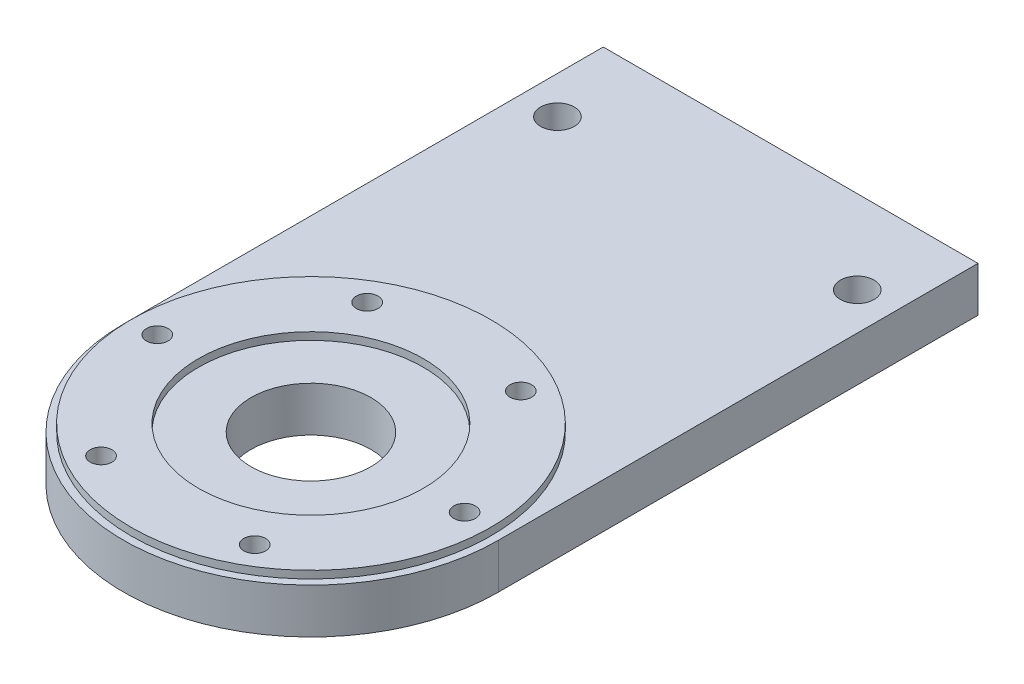
ISO-10303-21;
HEADER;
FILE_DESCRIPTION(('STEP AP214'),'2;1');
FILE_NAME('part.step','',(''),(''),'','','');
FILE_SCHEMA(('AUTOMOTIVE_DESIGN { 1 0 10303 214 1 1 1 1 }'));
ENDSEC;
DATA;
#1=APPLICATION_CONTEXT('core data for automotive mechanical design processes');
#2=APPLICATION_PROTOCOL_DEFINITION('international standard','automotive_design',2000,#1);
#3=PRODUCT_CONTEXT('',#1,'mechanical');
#4=PRODUCT('Part','Part','',(#3));
#5=PRODUCT_RELATED_PRODUCT_CATEGORY('part','',(#4));
#6=PRODUCT_DEFINITION_FORMATION('','',#4);
#7=PRODUCT_DEFINITION_CONTEXT('part definition',#1,'design');
#8=PRODUCT_DEFINITION('design','',#6,#7);
#9=PRODUCT_DEFINITION_SHAPE('','',#8);
#10=(LENGTH_UNIT() NAMED_UNIT(*) SI_UNIT(.MILLI.,.METRE.));
#11=(NAMED_UNIT(*) PLANE_ANGLE_UNIT() SI_UNIT($,.RADIAN.));
#12=(NAMED_UNIT(*) SI_UNIT($,.STERADIAN.) SOLID_ANGLE_UNIT());
#13=UNCERTAINTY_MEASURE_WITH_UNIT(LENGTH_MEASURE(1.E-05),#10,'distance_accuracy_value','');
#14=(GEOMETRIC_REPRESENTATION_CONTEXT(3) GLOBAL_UNCERTAINTY_ASSIGNED_CONTEXT((#13)) GLOBAL_UNIT_ASSIGNED_CONTEXT((#10,
#11,#12)) REPRESENTATION_CONTEXT('',''));
#15=CARTESIAN_POINT('',(0.,0.,0.));
#16=DIRECTION('',(0.,0.,1.));
#17=DIRECTION('',(1.,0.,0.));
#18=AXIS2_PLACEMENT_3D('',#15,#16,#17);
#19=CARTESIAN_POINT('',(25.,-21.5,490.));
#20=DIRECTION('',(-1.,0.,0.));
#21=DIRECTION('',(0.,0.,1.));
#22=AXIS2_PLACEMENT_3D('',#19,#20,#21);
#23=PLANE('',#22);
#24=DIRECTION('',(0.,0.,-1.));
#25=VECTOR('',#24,1.);
#26=CARTESIAN_POINT('',(25.,-27.5,490.));
#27=LINE('',#26,#25);
#28=CARTESIAN_POINT('',(25.,-27.5,490.));
#29=VERTEX_POINT('',#28);
#30=CARTESIAN_POINT('',(25.,-27.5,426.));
#31=VERTEX_POINT('',#30);
#32=EDGE_CURVE('E115',#29,#31,#27,.T.);
#33=ORIENTED_EDGE('',*,*,#32,.T.);
#34=DIRECTION('',(0.,-1.,0.));
#35=VECTOR('',#34,1.);
#36=CARTESIAN_POINT('',(25.,-21.5,426.));
#37=LINE('',#36,#35);
#38=CARTESIAN_POINT('',(25.,-21.5,426.));
#39=VERTEX_POINT('',#38);
#40=EDGE_CURVE('E52',#39,#31,#37,.T.);
#41=ORIENTED_EDGE('',*,*,#40,.F.);
#42=DIRECTION('',(0.,0.,-1.));
#43=VECTOR('',#42,1.);
#44=CARTESIAN_POINT('',(25.,-21.5,490.));
#45=LINE('',#44,#43);
#46=CARTESIAN_POINT('',(25.,-21.5,490.));
#47=VERTEX_POINT('',#46);
#48=EDGE_CURVE('E65',#47,#39,#45,.T.);
#49=ORIENTED_EDGE('',*,*,#48,.F.);
#50=DIRECTION('',(0.,-1.,0.));
#51=VECTOR('',#50,1.);
#52=CARTESIAN_POINT('',(25.,-21.5,490.));
#53=LINE('',#52,#51);
#54=EDGE_CURVE('E82',#47,#29,#53,.T.);
#55=ORIENTED_EDGE('',*,*,#54,.T.);
#56=EDGE_LOOP('',(#33,#41,#49,#55));
#57=FACE_BOUND('',#56,.T.);
#58=ADVANCED_FACE('F43',(#57),#23,.F.);
#59=CARTESIAN_POINT('',(-25.,-21.5,426.));
#60=DIRECTION('',(0.,0.,1.));
#61=DIRECTION('',(1.,0.,0.));
#62=AXIS2_PLACEMENT_3D('',#59,#60,#61);
#63=PLANE('',#62);
#64=DIRECTION('',(-1.,0.,0.));
#65=VECTOR('',#64,1.);
#66=CARTESIAN_POINT('',(-25.,-27.5,426.));
#67=LINE('',#66,#65);
#68=CARTESIAN_POINT('',(-25.,-27.5,426.));
#69=VERTEX_POINT('',#68);
#70=EDGE_CURVE('E80',#31,#69,#67,.T.);
#71=ORIENTED_EDGE('',*,*,#70,.T.);
#72=DIRECTION('',(0.,-1.,0.));
#73=VECTOR('',#72,1.);
#74=CARTESIAN_POINT('',(-25.,-21.5,426.));
#75=LINE('',#74,#73);
#76=CARTESIAN_POINT('',(-25.,-21.5,426.));
#77=VERTEX_POINT('',#76);
#78=EDGE_CURVE('E96',#77,#69,#75,.T.);
#79=ORIENTED_EDGE('',*,*,#78,.F.);
#80=DIRECTION('',(-1.,0.,0.));
#81=VECTOR('',#80,1.);
#82=CARTESIAN_POINT('',(-25.,-21.5,426.));
#83=LINE('',#82,#81);
#84=EDGE_CURVE('E87',#39,#77,#83,.T.);
#85=ORIENTED_EDGE('',*,*,#84,.F.);
#86=ORIENTED_EDGE('',*,*,#40,.T.);
#87=EDGE_LOOP('',(#71,#79,#85,#86));
#88=FACE_BOUND('',#87,.T.);
#89=ADVANCED_FACE('F226',(#88),#63,.F.);
#90=CARTESIAN_POINT('',(-25.,-21.5,490.));
#91=DIRECTION('',(1.,0.,0.));
#92=DIRECTION('',(0.,0.,-1.));
#93=AXIS2_PLACEMENT_3D('',#90,#91,#92);
#94=PLANE('',#93);
#95=DIRECTION('',(0.,0.,1.));
#96=VECTOR('',#95,1.);
#97=CARTESIAN_POINT('',(-25.,-27.5,490.));
#98=LINE('',#97,#96);
#99=CARTESIAN_POINT('',(-25.,-27.5,490.));
#100=VERTEX_POINT('',#99);
#101=EDGE_CURVE('E91',#69,#100,#98,.T.);
#102=ORIENTED_EDGE('',*,*,#101,.T.);
#103=DIRECTION('',(0.,-1.,0.));
#104=VECTOR('',#103,1.);
#105=CARTESIAN_POINT('',(-25.,-21.5,490.));
#106=LINE('',#105,#104);
#107=CARTESIAN_POINT('',(-25.,-21.5,490.));
#108=VERTEX_POINT('',#107);
#109=EDGE_CURVE('E98',#108,#100,#106,.T.);
#110=ORIENTED_EDGE('',*,*,#109,.F.);
#111=DIRECTION('',(0.,0.,1.));
#112=VECTOR('',#111,1.);
#113=CARTESIAN_POINT('',(-25.,-21.5,490.));
#114=LINE('',#113,#112);
#115=EDGE_CURVE('E129',#77,#108,#114,.T.);
#116=ORIENTED_EDGE('',*,*,#115,.F.);
#117=ORIENTED_EDGE('',*,*,#78,.T.);
#118=EDGE_LOOP('',(#102,#110,#116,#117));
#119=FACE_BOUND('',#118,.T.);
#120=ADVANCED_FACE('F93',(#119),#94,.F.);
#121=CARTESIAN_POINT('',(0.,-21.5,0.));
#122=DIRECTION('',(0.,-1.,0.));
#123=DIRECTION('',(0.,0.,-1.));
#124=AXIS2_PLACEMENT_3D('',#121,#122,#123);
#125=PLANE('',#124);
#126=CARTESIAN_POINT('',(-20.,-21.5,437.11));
#127=DIRECTION('',(0.,1.,0.));
#128=DIRECTION('',(0.,0.,1.));
#129=AXIS2_PLACEMENT_3D('',#126,#127,#128);
#130=CIRCLE('',#129,2.25);
#131=CARTESIAN_POINT('',(-20.,-21.5,439.36));
#132=VERTEX_POINT('',#131);
#133=EDGE_CURVE('E322',#132,#132,#130,.T.);
#134=ORIENTED_EDGE('',*,*,#133,.F.);
#135=EDGE_LOOP('',(#134));
#136=FACE_BOUND('',#135,.T.);
#137=CARTESIAN_POINT('',(20.,-21.5,437.11));
#138=DIRECTION('',(0.,1.,0.));
#139=DIRECTION('',(0.,0.,1.));
#140=AXIS2_PLACEMENT_3D('',#137,#138,#139);
#141=CIRCLE('',#140,2.25);
#142=CARTESIAN_POINT('',(20.,-21.5,439.36));
#143=VERTEX_POINT('',#142);
#144=EDGE_CURVE('E382',#143,#143,#141,.T.);
#145=ORIENTED_EDGE('',*,*,#144,.F.);
#146=EDGE_LOOP('',(#145));
#147=FACE_BOUND('',#146,.T.);
#148=CARTESIAN_POINT('',(0.,-21.5,490.));
#149=DIRECTION('',(0.,1.,0.));
#150=DIRECTION('',(0.,0.,1.));
#151=AXIS2_PLACEMENT_3D('',#148,#149,#150);
#152=CIRCLE('',#151,24.);
#153=CARTESIAN_POINT('',(0.,-21.5,514.));
#154=VERTEX_POINT('',#153);
#155=EDGE_CURVE('E11',#154,#154,#152,.T.);
#156=ORIENTED_EDGE('',*,*,#155,.F.);
#157=EDGE_LOOP('',(#156));
#158=FACE_BOUND('',#157,.T.);
#159=ORIENTED_EDGE('',*,*,#115,.T.);
#160=CARTESIAN_POINT('',(0.,-21.5,490.));
#161=DIRECTION('',(0.,1.,0.));
#162=DIRECTION('',(0.,0.,1.));
#163=AXIS2_PLACEMENT_3D('',#160,#161,#162);
#164=CIRCLE('',#163,25.);
#165=EDGE_CURVE('E108',#108,#47,#164,.T.);
#166=ORIENTED_EDGE('',*,*,#165,.T.);
#167=ORIENTED_EDGE('',*,*,#48,.T.);
#168=ORIENTED_EDGE('',*,*,#84,.T.);
#169=EDGE_LOOP('',(#159,#166,#167,#168));
#170=FACE_BOUND('',#169,.T.);
#171=ADVANCED_FACE('F224',(#136,#147,#158,#170),#125,.F.);
#172=CARTESIAN_POINT('',(0.,-27.5,0.));
#173=DIRECTION('',(0.,-1.,0.));
#174=DIRECTION('',(0.,0.,-1.));
#175=AXIS2_PLACEMENT_3D('',#172,#173,#174);
#176=PLANE('',#175);
#177=CARTESIAN_POINT('',(-20.,-27.5,437.11));
#178=DIRECTION('',(0.,1.,0.));
#179=DIRECTION('',(0.,0.,1.));
#180=AXIS2_PLACEMENT_3D('',#177,#178,#179);
#181=CIRCLE('',#180,2.25);
#182=CARTESIAN_POINT('',(-20.,-27.5,439.36));
#183=VERTEX_POINT('',#182);
#184=EDGE_CURVE('E373',#183,#183,#181,.T.);
#185=ORIENTED_EDGE('',*,*,#184,.T.);
#186=EDGE_LOOP('',(#185));
#187=FACE_BOUND('',#186,.T.);
#188=CARTESIAN_POINT('',(20.,-27.5,437.11));
#189=DIRECTION('',(0.,1.,0.));
#190=DIRECTION('',(0.,0.,1.));
#191=AXIS2_PLACEMENT_3D('',#188,#189,#190);
#192=CIRCLE('',#191,2.25);
#193=CARTESIAN_POINT('',(20.,-27.5,439.36));
#194=VERTEX_POINT('',#193);
#195=EDGE_CURVE('E374',#194,#194,#192,.T.);
#196=ORIENTED_EDGE('',*,*,#195,.T.);
#197=EDGE_LOOP('',(#196));
#198=FACE_BOUND('',#197,.T.);
#199=CARTESIAN_POINT('',(10.25,-27.5,472.246479222419));
#200=DIRECTION('',(0.,1.,0.));
#201=DIRECTION('',(0.,0.,1.));
#202=AXIS2_PLACEMENT_3D('',#199,#200,#201);
#203=CIRCLE('',#202,2.75);
#204=CARTESIAN_POINT('',(10.25,-27.5,474.996479222419));
#205=VERTEX_POINT('',#204);
#206=EDGE_CURVE('E304',#205,#205,#203,.T.);
#207=ORIENTED_EDGE('',*,*,#206,.T.);
#208=EDGE_LOOP('',(#207));
#209=FACE_BOUND('',#208,.T.);
#210=CARTESIAN_POINT('',(-10.25,-27.5,472.246479222419));
#211=DIRECTION('',(0.,1.,0.));
#212=DIRECTION('',(0.,0.,1.));
#213=AXIS2_PLACEMENT_3D('',#210,#211,#212);
#214=CIRCLE('',#213,2.75);
#215=CARTESIAN_POINT('',(-10.25,-27.5,474.996479222419));
#216=VERTEX_POINT('',#215);
#217=EDGE_CURVE('E302',#216,#216,#214,.T.);
#218=ORIENTED_EDGE('',*,*,#217,.T.);
#219=EDGE_LOOP('',(#218));
#220=FACE_BOUND('',#219,.T.);
#221=CARTESIAN_POINT('',(-10.25,-27.5,507.753520777581));
#222=DIRECTION('',(0.,1.,0.));
#223=DIRECTION('',(0.,0.,1.));
#224=AXIS2_PLACEMENT_3D('',#221,#222,#223);
#225=CIRCLE('',#224,2.75);
#226=CARTESIAN_POINT('',(-10.25,-27.5,510.503520777581));
#227=VERTEX_POINT('',#226);
#228=EDGE_CURVE('E330',#227,#227,#225,.T.);
#229=ORIENTED_EDGE('',*,*,#228,.T.);
#230=EDGE_LOOP('',(#229));
#231=FACE_BOUND('',#230,.T.);
#232=CARTESIAN_POINT('',(10.25,-27.5,507.753520777581));
#233=DIRECTION('',(0.,1.,0.));
#234=DIRECTION('',(0.,0.,1.));
#235=AXIS2_PLACEMENT_3D('',#232,#233,#234);
#236=CIRCLE('',#235,2.75);
#237=CARTESIAN_POINT('',(10.25,-27.5,510.503520777581));
#238=VERTEX_POINT('',#237);
#239=EDGE_CURVE('E321',#238,#238,#236,.T.);
#240=ORIENTED_EDGE('',*,*,#239,.T.);
#241=EDGE_LOOP('',(#240));
#242=FACE_BOUND('',#241,.T.);
#243=CARTESIAN_POINT('',(20.5,-27.5,490.));
#244=DIRECTION('',(0.,1.,0.));
#245=DIRECTION('',(0.,0.,1.));
#246=AXIS2_PLACEMENT_3D('',#243,#244,#245);
#247=CIRCLE('',#246,1.45);
#248=CARTESIAN_POINT('',(20.5,-27.5,491.45));
#249=VERTEX_POINT('',#248);
#250=EDGE_CURVE('E181',#249,#249,#247,.T.);
#251=ORIENTED_EDGE('',*,*,#250,.T.);
#252=EDGE_LOOP('',(#251));
#253=FACE_BOUND('',#252,.T.);
#254=CARTESIAN_POINT('',(-20.5,-27.5,490.));
#255=DIRECTION('',(0.,1.,0.));
#256=DIRECTION('',(0.,0.,1.));
#257=AXIS2_PLACEMENT_3D('',#254,#255,#256);
#258=CIRCLE('',#257,1.45);
#259=CARTESIAN_POINT('',(-20.5,-27.5,491.45));
#260=VERTEX_POINT('',#259);
#261=EDGE_CURVE('E192',#260,#260,#258,.T.);
#262=ORIENTED_EDGE('',*,*,#261,.T.);
#263=EDGE_LOOP('',(#262));
#264=FACE_BOUND('',#263,.T.);
#265=CARTESIAN_POINT('',(0.,-27.5,490.));
#266=DIRECTION('',(0.,1.,0.));
#267=DIRECTION('',(0.,0.,1.));
#268=AXIS2_PLACEMENT_3D('',#265,#266,#267);
#269=CIRCLE('',#268,8.);
#270=CARTESIAN_POINT('',(0.,-27.5,498.));
#271=VERTEX_POINT('',#270);
#272=EDGE_CURVE('E143',#271,#271,#269,.T.);
#273=ORIENTED_EDGE('',*,*,#272,.T.);
#274=EDGE_LOOP('',(#273));
#275=FACE_BOUND('',#274,.T.);
#276=ORIENTED_EDGE('',*,*,#32,.F.);
#277=CARTESIAN_POINT('',(0.,-27.5,490.));
#278=DIRECTION('',(0.,1.,0.));
#279=DIRECTION('',(0.,0.,1.));
#280=AXIS2_PLACEMENT_3D('',#277,#278,#279);
#281=CIRCLE('',#280,25.);
#282=EDGE_CURVE('E106',#100,#29,#281,.T.);
#283=ORIENTED_EDGE('',*,*,#282,.F.);
#284=ORIENTED_EDGE('',*,*,#101,.F.);
#285=ORIENTED_EDGE('',*,*,#70,.F.);
#286=EDGE_LOOP('',(#276,#283,#284,#285));
#287=FACE_BOUND('',#286,.T.);
#288=ADVANCED_FACE('F111',(#187,#198,#209,#220,#231,#242,#253,#264,#275,#287),#176,.T.);
#289=CARTESIAN_POINT('',(0.,-21.5,490.));
#290=DIRECTION('',(0.,-1.,0.));
#291=DIRECTION('',(0.,0.,-1.));
#292=AXIS2_PLACEMENT_3D('',#289,#290,#291);
#293=CYLINDRICAL_SURFACE('',#292,25.);
#294=ORIENTED_EDGE('',*,*,#282,.T.);
#295=ORIENTED_EDGE('',*,*,#54,.F.);
#296=ORIENTED_EDGE('',*,*,#165,.F.);
#297=ORIENTED_EDGE('',*,*,#109,.T.);
#298=EDGE_LOOP('',(#294,#295,#296,#297));
#299=FACE_BOUND('',#298,.T.);
#300=ADVANCED_FACE('F102',(#299),#293,.T.);
#301=CARTESIAN_POINT('',(0.,-20.5,490.));
#302=DIRECTION('',(0.,1.,0.));
#303=DIRECTION('',(0.,0.,1.));
#304=AXIS2_PLACEMENT_3D('',#301,#302,#303);
#305=PLANE('',#304);
#306=CARTESIAN_POINT('',(20.5,-20.5,490.));
#307=DIRECTION('',(0.,1.,0.));
#308=DIRECTION('',(0.,0.,1.));
#309=AXIS2_PLACEMENT_3D('',#306,#307,#308);
#310=CIRCLE('',#309,1.45);
#311=CARTESIAN_POINT('',(20.5,-20.5,491.45));
#312=VERTEX_POINT('',#311);
#313=EDGE_CURVE('E196',#312,#312,#310,.T.);
#314=ORIENTED_EDGE('',*,*,#313,.F.);
#315=EDGE_LOOP('',(#314));
#316=FACE_BOUND('',#315,.T.);
#317=CARTESIAN_POINT('',(10.25,-20.5,472.246479222419));
#318=DIRECTION('',(0.,1.,0.));
#319=DIRECTION('',(0.,0.,1.));
#320=AXIS2_PLACEMENT_3D('',#317,#318,#319);
#321=CIRCLE('',#320,1.45);
#322=CARTESIAN_POINT('',(10.25,-20.5,473.696479222419));
#323=VERTEX_POINT('',#322);
#324=EDGE_CURVE('E161',#323,#323,#321,.T.);
#325=ORIENTED_EDGE('',*,*,#324,.F.);
#326=EDGE_LOOP('',(#325));
#327=FACE_BOUND('',#326,.T.);
#328=CARTESIAN_POINT('',(-10.25,-20.5,472.246479222419));
#329=DIRECTION('',(0.,1.,0.));
#330=DIRECTION('',(0.,0.,1.));
#331=AXIS2_PLACEMENT_3D('',#328,#329,#330);
#332=CIRCLE('',#331,1.45);
#333=CARTESIAN_POINT('',(-10.25,-20.5,473.696479222419));
#334=VERTEX_POINT('',#333);
#335=EDGE_CURVE('E169',#334,#334,#332,.T.);
#336=ORIENTED_EDGE('',*,*,#335,.F.);
#337=EDGE_LOOP('',(#336));
#338=FACE_BOUND('',#337,.T.);
#339=CARTESIAN_POINT('',(-20.5,-20.5,490.));
#340=DIRECTION('',(0.,1.,0.));
#341=DIRECTION('',(0.,0.,1.));
#342=AXIS2_PLACEMENT_3D('',#339,#340,#341);
#343=CIRCLE('',#342,1.45);
#344=CARTESIAN_POINT('',(-20.5,-20.5,491.45));
#345=VERTEX_POINT('',#344);
#346=EDGE_CURVE('E180',#345,#345,#343,.T.);
#347=ORIENTED_EDGE('',*,*,#346,.F.);
#348=EDGE_LOOP('',(#347));
#349=FACE_BOUND('',#348,.T.);
#350=CARTESIAN_POINT('',(-10.25,-20.5,507.753520777581));
#351=DIRECTION('',(0.,1.,0.));
#352=DIRECTION('',(0.,0.,1.));
#353=AXIS2_PLACEMENT_3D('',#350,#351,#352);
#354=CIRCLE('',#353,1.45);
#355=CARTESIAN_POINT('',(-10.25,-20.5,509.203520777581));
#356=VERTEX_POINT('',#355);
#357=EDGE_CURVE('E190',#356,#356,#354,.T.);
#358=ORIENTED_EDGE('',*,*,#357,.F.);
#359=EDGE_LOOP('',(#358));
#360=FACE_BOUND('',#359,.T.);
#361=CARTESIAN_POINT('',(10.25,-20.5,507.753520777581));
#362=DIRECTION('',(0.,1.,0.));
#363=DIRECTION('',(0.,0.,1.));
#364=AXIS2_PLACEMENT_3D('',#361,#362,#363);
#365=CIRCLE('',#364,1.45);
#366=CARTESIAN_POINT('',(10.25,-20.5,509.203520777581));
#367=VERTEX_POINT('',#366);
#368=EDGE_CURVE('E182',#367,#367,#365,.T.);
#369=ORIENTED_EDGE('',*,*,#368,.F.);
#370=EDGE_LOOP('',(#369));
#371=FACE_BOUND('',#370,.T.);
#372=CARTESIAN_POINT('',(0.,-20.5,490.));
#373=DIRECTION('',(0.,1.,0.));
#374=DIRECTION('',(0.,0.,1.));
#375=AXIS2_PLACEMENT_3D('',#372,#373,#374);
#376=CIRCLE('',#375,24.);
#377=CARTESIAN_POINT('',(0.,-20.5,514.));
#378=VERTEX_POINT('',#377);
#379=EDGE_CURVE('E112',#378,#378,#376,.T.);
#380=ORIENTED_EDGE('',*,*,#379,.T.);
#381=EDGE_LOOP('',(#380));
#382=FACE_BOUND('',#381,.T.);
#383=CARTESIAN_POINT('',(0.,-20.5,490.));
#384=DIRECTION('',(0.,1.,0.));
#385=DIRECTION('',(0.,0.,1.));
#386=AXIS2_PLACEMENT_3D('',#383,#384,#385);
#387=CIRCLE('',#386,15.);
#388=CARTESIAN_POINT('',(0.,-20.5,505.));
#389=VERTEX_POINT('',#388);
#390=EDGE_CURVE('E125',#389,#389,#387,.T.);
#391=ORIENTED_EDGE('',*,*,#390,.F.);
#392=EDGE_LOOP('',(#391));
#393=FACE_BOUND('',#392,.T.);
#394=ADVANCED_FACE('F221',(#316,#327,#338,#349,#360,#371,#382,#393),#305,.T.);
#395=CARTESIAN_POINT('',(0.,-20.5,490.));
#396=DIRECTION('',(0.,-1.,0.));
#397=DIRECTION('',(0.,0.,-1.));
#398=AXIS2_PLACEMENT_3D('',#395,#396,#397);
#399=CYLINDRICAL_SURFACE('',#398,24.);
#400=ORIENTED_EDGE('',*,*,#379,.F.);
#401=EDGE_LOOP('',(#400));
#402=FACE_BOUND('',#401,.T.);
#403=ORIENTED_EDGE('',*,*,#155,.T.);
#404=EDGE_LOOP('',(#403));
#405=FACE_BOUND('',#404,.T.);
#406=ADVANCED_FACE('F215',(#402,#405),#399,.T.);
#407=CARTESIAN_POINT('',(0.,-20.5,490.));
#408=DIRECTION('',(0.,-1.,0.));
#409=DIRECTION('',(0.,0.,-1.));
#410=AXIS2_PLACEMENT_3D('',#407,#408,#409);
#411=CYLINDRICAL_SURFACE('',#410,15.);
#412=ORIENTED_EDGE('',*,*,#390,.T.);
#413=EDGE_LOOP('',(#412));
#414=FACE_BOUND('',#413,.T.);
#415=CARTESIAN_POINT('',(0.,-21.5,490.));
#416=DIRECTION('',(0.,1.,0.));
#417=DIRECTION('',(0.,0.,1.));
#418=AXIS2_PLACEMENT_3D('',#415,#416,#417);
#419=CIRCLE('',#418,15.);
#420=CARTESIAN_POINT('',(0.,-21.5,505.));
#421=VERTEX_POINT('',#420);
#422=EDGE_CURVE('E144',#421,#421,#419,.T.);
#423=ORIENTED_EDGE('',*,*,#422,.F.);
#424=EDGE_LOOP('',(#423));
#425=FACE_BOUND('',#424,.T.);
#426=ADVANCED_FACE('F208',(#414,#425),#411,.F.);
#427=CARTESIAN_POINT('',(0.,-21.5,490.));
#428=DIRECTION('',(0.,-1.,0.));
#429=DIRECTION('',(0.,0.,-1.));
#430=AXIS2_PLACEMENT_3D('',#427,#428,#429);
#431=CIRCLE('',#430,8.);
#432=CARTESIAN_POINT('',(0.,-21.5,482.));
#433=VERTEX_POINT('',#432);
#434=EDGE_CURVE('E137',#433,#433,#431,.F.);
#435=ORIENTED_EDGE('',*,*,#434,.F.);
#436=EDGE_LOOP('',(#435));
#437=FACE_BOUND('',#436,.T.);
#438=ORIENTED_EDGE('',*,*,#422,.T.);
#439=EDGE_LOOP('',(#438));
#440=FACE_BOUND('',#439,.T.);
#441=ADVANCED_FACE('F206',(#437,#440),#125,.F.);
#442=CARTESIAN_POINT('',(0.,-20.5,490.));
#443=DIRECTION('',(0.,-1.,0.));
#444=DIRECTION('',(0.,0.,-1.));
#445=AXIS2_PLACEMENT_3D('',#442,#443,#444);
#446=CYLINDRICAL_SURFACE('',#445,8.);
#447=ORIENTED_EDGE('',*,*,#272,.F.);
#448=EDGE_LOOP('',(#447));
#449=FACE_BOUND('',#448,.T.);
#450=ORIENTED_EDGE('',*,*,#434,.T.);
#451=EDGE_LOOP('',(#450));
#452=FACE_BOUND('',#451,.T.);
#453=ADVANCED_FACE('F219',(#449,#452),#446,.F.);
#454=CARTESIAN_POINT('',(10.25,-20.5,507.753520777581));
#455=DIRECTION('',(0.,-1.,0.));
#456=DIRECTION('',(0.,0.,-1.));
#457=AXIS2_PLACEMENT_3D('',#454,#455,#456);
#458=CYLINDRICAL_SURFACE('',#457,1.45);
#459=CARTESIAN_POINT('',(10.25,-25.,507.753520777581));
#460=DIRECTION('',(0.,1.,0.));
#461=DIRECTION('',(0.,0.,1.));
#462=AXIS2_PLACEMENT_3D('',#459,#460,#461);
#463=CIRCLE('',#462,1.45);
#464=CARTESIAN_POINT('',(10.25,-25.,509.203520777581));
#465=VERTEX_POINT('',#464);
#466=EDGE_CURVE('E46',#465,#465,#463,.T.);
#467=ORIENTED_EDGE('',*,*,#466,.F.);
#468=EDGE_LOOP('',(#467));
#469=FACE_BOUND('',#468,.T.);
#470=ORIENTED_EDGE('',*,*,#368,.T.);
#471=EDGE_LOOP('',(#470));
#472=FACE_BOUND('',#471,.T.);
#473=ADVANCED_FACE('F261',(#469,#472),#458,.F.);
#474=CARTESIAN_POINT('',(-10.25,-20.5,507.753520777581));
#475=DIRECTION('',(0.,-1.,0.));
#476=DIRECTION('',(0.,0.,-1.));
#477=AXIS2_PLACEMENT_3D('',#474,#475,#476);
#478=CYLINDRICAL_SURFACE('',#477,1.45);
#479=CARTESIAN_POINT('',(-10.25,-25.,507.753520777581));
#480=DIRECTION('',(0.,1.,0.));
#481=DIRECTION('',(0.,0.,1.));
#482=AXIS2_PLACEMENT_3D('',#479,#480,#481);
#483=CIRCLE('',#482,1.45);
#484=CARTESIAN_POINT('',(-10.25,-25.,509.203520777581));
#485=VERTEX_POINT('',#484);
#486=EDGE_CURVE('E151',#485,#485,#483,.T.);
#487=ORIENTED_EDGE('',*,*,#486,.F.);
#488=EDGE_LOOP('',(#487));
#489=FACE_BOUND('',#488,.T.);
#490=ORIENTED_EDGE('',*,*,#357,.T.);
#491=EDGE_LOOP('',(#490));
#492=FACE_BOUND('',#491,.T.);
#493=ADVANCED_FACE('F269',(#489,#492),#478,.F.);
#494=CARTESIAN_POINT('',(-20.5,-20.5,490.));
#495=DIRECTION('',(0.,-1.,0.));
#496=DIRECTION('',(0.,0.,-1.));
#497=AXIS2_PLACEMENT_3D('',#494,#495,#496);
#498=CYLINDRICAL_SURFACE('',#497,1.45);
#499=ORIENTED_EDGE('',*,*,#346,.T.);
#500=EDGE_LOOP('',(#499));
#501=FACE_BOUND('',#500,.T.);
#502=ORIENTED_EDGE('',*,*,#261,.F.);
#503=EDGE_LOOP('',(#502));
#504=FACE_BOUND('',#503,.T.);
#505=ADVANCED_FACE('F275',(#501,#504),#498,.F.);
#506=CARTESIAN_POINT('',(-10.25,-20.5,472.246479222419));
#507=DIRECTION('',(0.,-1.,0.));
#508=DIRECTION('',(0.,0.,-1.));
#509=AXIS2_PLACEMENT_3D('',#506,#507,#508);
#510=CYLINDRICAL_SURFACE('',#509,1.45);
#511=CARTESIAN_POINT('',(-10.25,-25.,472.246479222419));
#512=DIRECTION('',(0.,1.,0.));
#513=DIRECTION('',(0.,0.,1.));
#514=AXIS2_PLACEMENT_3D('',#511,#512,#513);
#515=CIRCLE('',#514,1.45);
#516=CARTESIAN_POINT('',(-10.25,-25.,473.696479222419));
#517=VERTEX_POINT('',#516);
#518=EDGE_CURVE('E148',#517,#517,#515,.T.);
#519=ORIENTED_EDGE('',*,*,#518,.F.);
#520=EDGE_LOOP('',(#519));
#521=FACE_BOUND('',#520,.T.);
#522=ORIENTED_EDGE('',*,*,#335,.T.);
#523=EDGE_LOOP('',(#522));
#524=FACE_BOUND('',#523,.T.);
#525=ADVANCED_FACE('F285',(#521,#524),#510,.F.);
#526=CARTESIAN_POINT('',(10.25,-20.5,472.246479222419));
#527=DIRECTION('',(0.,-1.,0.));
#528=DIRECTION('',(0.,0.,-1.));
#529=AXIS2_PLACEMENT_3D('',#526,#527,#528);
#530=CYLINDRICAL_SURFACE('',#529,1.45);
#531=CARTESIAN_POINT('',(10.25,-25.,472.246479222419));
#532=DIRECTION('',(0.,1.,0.));
#533=DIRECTION('',(0.,0.,1.));
#534=AXIS2_PLACEMENT_3D('',#531,#532,#533);
#535=CIRCLE('',#534,1.45);
#536=CARTESIAN_POINT('',(10.25,-25.,473.696479222419));
#537=VERTEX_POINT('',#536);
#538=EDGE_CURVE('E147',#537,#537,#535,.T.);
#539=ORIENTED_EDGE('',*,*,#538,.F.);
#540=EDGE_LOOP('',(#539));
#541=FACE_BOUND('',#540,.T.);
#542=ORIENTED_EDGE('',*,*,#324,.T.);
#543=EDGE_LOOP('',(#542));
#544=FACE_BOUND('',#543,.T.);
#545=ADVANCED_FACE('F280',(#541,#544),#530,.F.);
#546=CARTESIAN_POINT('',(20.5,-20.5,490.));
#547=DIRECTION('',(0.,-1.,0.));
#548=DIRECTION('',(0.,0.,-1.));
#549=AXIS2_PLACEMENT_3D('',#546,#547,#548);
#550=CYLINDRICAL_SURFACE('',#549,1.45);
#551=ORIENTED_EDGE('',*,*,#313,.T.);
#552=EDGE_LOOP('',(#551));
#553=FACE_BOUND('',#552,.T.);
#554=ORIENTED_EDGE('',*,*,#250,.F.);
#555=EDGE_LOOP('',(#554));
#556=FACE_BOUND('',#555,.T.);
#557=ADVANCED_FACE('F290',(#553,#556),#550,.F.);
#558=CARTESIAN_POINT('',(10.25,-25.,472.246479222419));
#559=DIRECTION('',(0.,-1.,0.));
#560=DIRECTION('',(0.,0.,-1.));
#561=AXIS2_PLACEMENT_3D('',#558,#559,#560);
#562=CYLINDRICAL_SURFACE('',#561,2.75);
#563=CARTESIAN_POINT('',(10.25,-25.,472.246479222419));
#564=DIRECTION('',(0.,1.,0.));
#565=DIRECTION('',(0.,0.,1.));
#566=AXIS2_PLACEMENT_3D('',#563,#564,#565);
#567=CIRCLE('',#566,2.75);
#568=CARTESIAN_POINT('',(10.25,-25.,474.996479222419));
#569=VERTEX_POINT('',#568);
#570=EDGE_CURVE('E313',#569,#569,#567,.T.);
#571=ORIENTED_EDGE('',*,*,#570,.T.);
#572=EDGE_LOOP('',(#571));
#573=FACE_BOUND('',#572,.T.);
#574=ORIENTED_EDGE('',*,*,#206,.F.);
#575=EDGE_LOOP('',(#574));
#576=FACE_BOUND('',#575,.T.);
#577=ADVANCED_FACE('F332',(#573,#576),#562,.F.);
#578=CARTESIAN_POINT('',(10.25,-25.,472.246479222419));
#579=DIRECTION('',(0.,1.,0.));
#580=DIRECTION('',(0.,0.,1.));
#581=AXIS2_PLACEMENT_3D('',#578,#579,#580);
#582=PLANE('',#581);
#583=ORIENTED_EDGE('',*,*,#538,.T.);
#584=EDGE_LOOP('',(#583));
#585=FACE_BOUND('',#584,.T.);
#586=ORIENTED_EDGE('',*,*,#570,.F.);
#587=EDGE_LOOP('',(#586));
#588=FACE_BOUND('',#587,.T.);
#589=ADVANCED_FACE('F336',(#585,#588),#582,.F.);
#590=CARTESIAN_POINT('',(-10.25,-25.,472.246479222419));
#591=DIRECTION('',(0.,-1.,0.));
#592=DIRECTION('',(0.,0.,-1.));
#593=AXIS2_PLACEMENT_3D('',#590,#591,#592);
#594=CYLINDRICAL_SURFACE('',#593,2.75);
#595=CARTESIAN_POINT('',(-10.25,-25.,472.246479222419));
#596=DIRECTION('',(0.,1.,0.));
#597=DIRECTION('',(0.,0.,1.));
#598=AXIS2_PLACEMENT_3D('',#595,#596,#597);
#599=CIRCLE('',#598,2.75);
#600=CARTESIAN_POINT('',(-10.25,-25.,474.996479222419));
#601=VERTEX_POINT('',#600);
#602=EDGE_CURVE('E301',#601,#601,#599,.T.);
#603=ORIENTED_EDGE('',*,*,#602,.T.);
#604=EDGE_LOOP('',(#603));
#605=FACE_BOUND('',#604,.T.);
#606=ORIENTED_EDGE('',*,*,#217,.F.);
#607=EDGE_LOOP('',(#606));
#608=FACE_BOUND('',#607,.T.);
#609=ADVANCED_FACE('F300',(#605,#608),#594,.F.);
#610=CARTESIAN_POINT('',(-10.25,-25.,472.246479222419));
#611=DIRECTION('',(0.,1.,0.));
#612=DIRECTION('',(0.,0.,1.));
#613=AXIS2_PLACEMENT_3D('',#610,#611,#612);
#614=PLANE('',#613);
#615=ORIENTED_EDGE('',*,*,#518,.T.);
#616=EDGE_LOOP('',(#615));
#617=FACE_BOUND('',#616,.T.);
#618=ORIENTED_EDGE('',*,*,#602,.F.);
#619=EDGE_LOOP('',(#618));
#620=FACE_BOUND('',#619,.T.);
#621=ADVANCED_FACE('F291',(#617,#620),#614,.F.);
#622=CARTESIAN_POINT('',(-10.25,-25.,507.753520777581));
#623=DIRECTION('',(0.,-1.,0.));
#624=DIRECTION('',(0.,0.,-1.));
#625=AXIS2_PLACEMENT_3D('',#622,#623,#624);
#626=CYLINDRICAL_SURFACE('',#625,2.75);
#627=CARTESIAN_POINT('',(-10.25,-25.,507.753520777581));
#628=DIRECTION('',(0.,1.,0.));
#629=DIRECTION('',(0.,0.,1.));
#630=AXIS2_PLACEMENT_3D('',#627,#628,#629);
#631=CIRCLE('',#630,2.75);
#632=CARTESIAN_POINT('',(-10.25,-25.,510.503520777581));
#633=VERTEX_POINT('',#632);
#634=EDGE_CURVE('E309',#633,#633,#631,.T.);
#635=ORIENTED_EDGE('',*,*,#634,.T.);
#636=EDGE_LOOP('',(#635));
#637=FACE_BOUND('',#636,.T.);
#638=ORIENTED_EDGE('',*,*,#228,.F.);
#639=EDGE_LOOP('',(#638));
#640=FACE_BOUND('',#639,.T.);
#641=ADVANCED_FACE('F298',(#637,#640),#626,.F.);
#642=CARTESIAN_POINT('',(-10.25,-25.,507.753520777581));
#643=DIRECTION('',(0.,1.,0.));
#644=DIRECTION('',(0.,0.,1.));
#645=AXIS2_PLACEMENT_3D('',#642,#643,#644);
#646=PLANE('',#645);
#647=ORIENTED_EDGE('',*,*,#486,.T.);
#648=EDGE_LOOP('',(#647));
#649=FACE_BOUND('',#648,.T.);
#650=ORIENTED_EDGE('',*,*,#634,.F.);
#651=EDGE_LOOP('',(#650));
#652=FACE_BOUND('',#651,.T.);
#653=ADVANCED_FACE('F347',(#649,#652),#646,.F.);
#654=CARTESIAN_POINT('',(10.25,-25.,507.753520777581));
#655=DIRECTION('',(0.,-1.,0.));
#656=DIRECTION('',(0.,0.,-1.));
#657=AXIS2_PLACEMENT_3D('',#654,#655,#656);
#658=CYLINDRICAL_SURFACE('',#657,2.75);
#659=CARTESIAN_POINT('',(10.25,-25.,507.753520777581));
#660=DIRECTION('',(0.,1.,0.));
#661=DIRECTION('',(0.,0.,1.));
#662=AXIS2_PLACEMENT_3D('',#659,#660,#661);
#663=CIRCLE('',#662,2.75);
#664=CARTESIAN_POINT('',(10.25,-25.,510.503520777581));
#665=VERTEX_POINT('',#664);
#666=EDGE_CURVE('E152',#665,#665,#663,.T.);
#667=ORIENTED_EDGE('',*,*,#666,.T.);
#668=EDGE_LOOP('',(#667));
#669=FACE_BOUND('',#668,.T.);
#670=ORIENTED_EDGE('',*,*,#239,.F.);
#671=EDGE_LOOP('',(#670));
#672=FACE_BOUND('',#671,.T.);
#673=ADVANCED_FACE('F345',(#669,#672),#658,.F.);
#674=CARTESIAN_POINT('',(10.25,-25.,507.753520777581));
#675=DIRECTION('',(0.,1.,0.));
#676=DIRECTION('',(0.,0.,1.));
#677=AXIS2_PLACEMENT_3D('',#674,#675,#676);
#678=PLANE('',#677);
#679=ORIENTED_EDGE('',*,*,#466,.T.);
#680=EDGE_LOOP('',(#679));
#681=FACE_BOUND('',#680,.T.);
#682=ORIENTED_EDGE('',*,*,#666,.F.);
#683=EDGE_LOOP('',(#682));
#684=FACE_BOUND('',#683,.T.);
#685=ADVANCED_FACE('F343',(#681,#684),#678,.F.);
#686=CARTESIAN_POINT('',(20.,-21.5,437.11));
#687=DIRECTION('',(0.,-1.,0.));
#688=DIRECTION('',(0.,0.,-1.));
#689=AXIS2_PLACEMENT_3D('',#686,#687,#688);
#690=CYLINDRICAL_SURFACE('',#689,2.25);
#691=ORIENTED_EDGE('',*,*,#144,.T.);
#692=EDGE_LOOP('',(#691));
#693=FACE_BOUND('',#692,.T.);
#694=ORIENTED_EDGE('',*,*,#195,.F.);
#695=EDGE_LOOP('',(#694));
#696=FACE_BOUND('',#695,.T.);
#697=ADVANCED_FACE('F348',(#693,#696),#690,.F.);
#698=CARTESIAN_POINT('',(-20.,-21.5,437.11));
#699=DIRECTION('',(0.,-1.,0.));
#700=DIRECTION('',(0.,0.,-1.));
#701=AXIS2_PLACEMENT_3D('',#698,#699,#700);
#702=CYLINDRICAL_SURFACE('',#701,2.25);
#703=ORIENTED_EDGE('',*,*,#133,.T.);
#704=EDGE_LOOP('',(#703));
#705=FACE_BOUND('',#704,.T.);
#706=ORIENTED_EDGE('',*,*,#184,.F.);
#707=EDGE_LOOP('',(#706));
#708=FACE_BOUND('',#707,.T.);
#709=ADVANCED_FACE('F361',(#705,#708),#702,.F.);
#710=CLOSED_SHELL('',(#58,#89,#120,#171,#288,#300,#394,#406,#426,#441,#453,#473,#493,#505,#525,
#545,#557,#577,#589,#609,#621,#641,#653,#673,#685,#697,#709));
#711=MANIFOLD_SOLID_BREP('B2',#710);
#712=ADVANCED_BREP_SHAPE_REPRESENTATION('',(#18,#711),#14);
#713=SHAPE_DEFINITION_REPRESENTATION(#9,#712);
ENDSEC;
END-ISO-10303-21;
